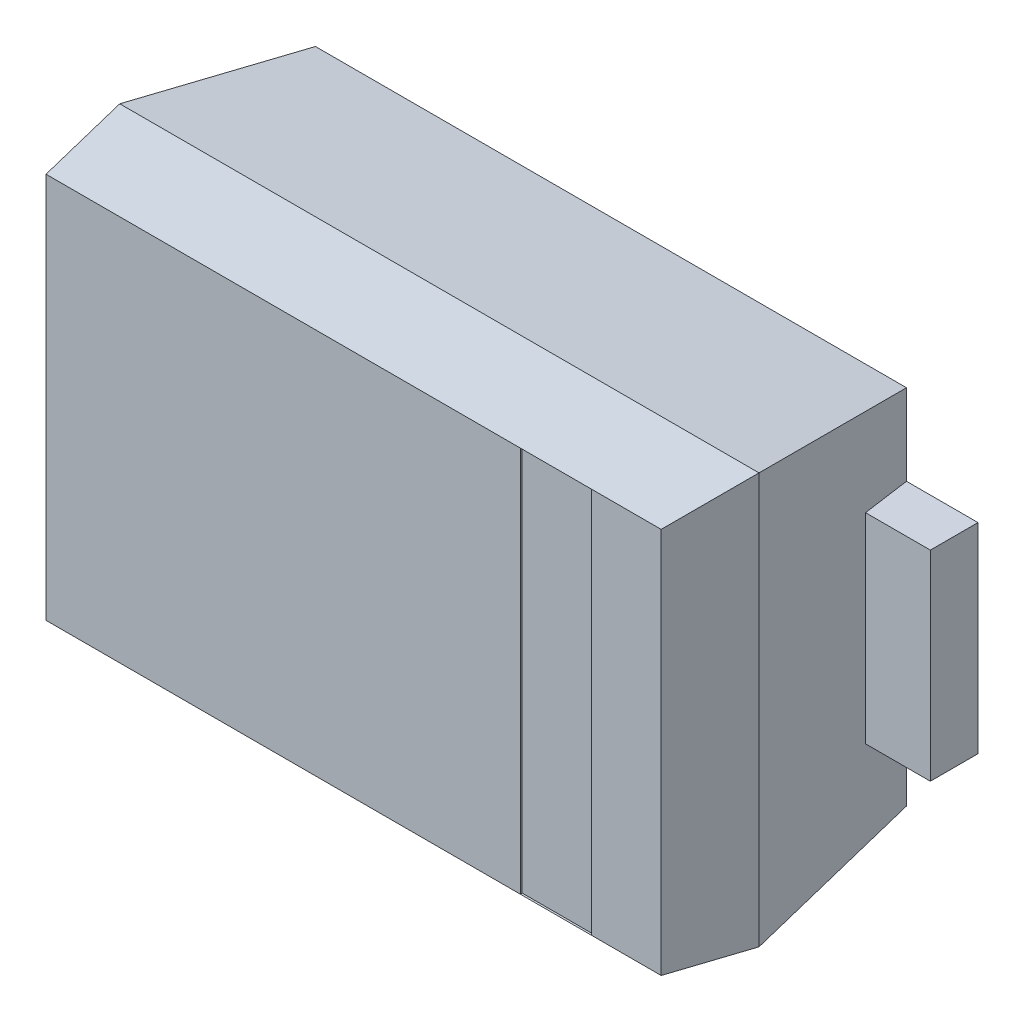
ISO-10303-21;
HEADER;
FILE_DESCRIPTION(('STEP AP214'),'2;1');
FILE_NAME('part.step','',(''),(''),'','','');
FILE_SCHEMA(('AUTOMOTIVE_DESIGN { 1 0 10303 214 1 1 1 1 }'));
ENDSEC;
DATA;
#1=APPLICATION_CONTEXT('core data for automotive mechanical design processes');
#2=APPLICATION_PROTOCOL_DEFINITION('international standard','automotive_design',2000,#1);
#3=PRODUCT_CONTEXT('',#1,'mechanical');
#4=PRODUCT('Part','Part','',(#3));
#5=PRODUCT_RELATED_PRODUCT_CATEGORY('part','',(#4));
#6=PRODUCT_DEFINITION_FORMATION('','',#4);
#7=PRODUCT_DEFINITION_CONTEXT('part definition',#1,'design');
#8=PRODUCT_DEFINITION('design','',#6,#7);
#9=PRODUCT_DEFINITION_SHAPE('','',#8);
#10=(LENGTH_UNIT() NAMED_UNIT(*) SI_UNIT(.MILLI.,.METRE.));
#11=(NAMED_UNIT(*) PLANE_ANGLE_UNIT() SI_UNIT($,.RADIAN.));
#12=(NAMED_UNIT(*) SI_UNIT($,.STERADIAN.) SOLID_ANGLE_UNIT());
#13=UNCERTAINTY_MEASURE_WITH_UNIT(LENGTH_MEASURE(1.E-05),#10,'distance_accuracy_value','');
#14=(GEOMETRIC_REPRESENTATION_CONTEXT(3) GLOBAL_UNCERTAINTY_ASSIGNED_CONTEXT((#13)) GLOBAL_UNIT_ASSIGNED_CONTEXT((#10,
#11,#12)) REPRESENTATION_CONTEXT('',''));
#15=CARTESIAN_POINT('',(0.,0.,0.));
#16=DIRECTION('',(0.,0.,1.));
#17=DIRECTION('',(1.,0.,0.));
#18=AXIS2_PLACEMENT_3D('',#15,#16,#17);
#19=CARTESIAN_POINT('',(0.,0.,1.35));
#20=DIRECTION('',(0.,0.,-1.));
#21=DIRECTION('',(-1.,0.,0.));
#22=AXIS2_PLACEMENT_3D('',#19,#20,#21);
#23=PLANE('',#22);
#24=DIRECTION('',(1.,0.,0.));
#25=VECTOR('',#24,1.);
#26=CARTESIAN_POINT('',(0.,1.01324337561608,1.35));
#27=LINE('',#26,#25);
#28=CARTESIAN_POINT('',(1.61324337561608,1.01324337561608,1.35));
#29=VERTEX_POINT('',#28);
#30=CARTESIAN_POINT('',(1.24663932732601,1.01324337561608,1.35));
#31=VERTEX_POINT('',#30);
#32=EDGE_CURVE('E227',#29,#31,#27,.F.);
#33=ORIENTED_EDGE('',*,*,#32,.T.);
#34=DIRECTION('',(0.,1.,0.));
#35=VECTOR('',#34,1.);
#36=CARTESIAN_POINT('',(1.24663932732601,1.01324337561608,1.35));
#37=LINE('',#36,#35);
#38=CARTESIAN_POINT('',(1.24663932732601,-1.01324337561608,1.35));
#39=VERTEX_POINT('',#38);
#40=EDGE_CURVE('E53',#39,#31,#37,.T.);
#41=ORIENTED_EDGE('',*,*,#40,.F.);
#42=DIRECTION('',(-1.,0.,0.));
#43=VECTOR('',#42,1.);
#44=CARTESIAN_POINT('',(0.,-1.01324337561608,1.35));
#45=LINE('',#44,#43);
#46=CARTESIAN_POINT('',(1.61324337561608,-1.01324337561608,1.35));
#47=VERTEX_POINT('',#46);
#48=EDGE_CURVE('E237',#39,#47,#45,.F.);
#49=ORIENTED_EDGE('',*,*,#48,.T.);
#50=DIRECTION('',(0.,-1.,0.));
#51=VECTOR('',#50,1.);
#52=CARTESIAN_POINT('',(1.61324337561608,0.,1.35));
#53=LINE('',#52,#51);
#54=EDGE_CURVE('E242',#47,#29,#53,.F.);
#55=ORIENTED_EDGE('',*,*,#54,.T.);
#56=EDGE_LOOP('',(#33,#41,#49,#55));
#57=FACE_BOUND('',#56,.T.);
#58=ADVANCED_FACE('F37',(#57),#23,.F.);
#59=CARTESIAN_POINT('',(1.925,-0.524999999999999,0.25));
#60=DIRECTION('',(0.,1.,0.));
#61=DIRECTION('',(-1.,0.,0.));
#62=AXIS2_PLACEMENT_3D('',#59,#60,#61);
#63=PLANE('',#62);
#64=DIRECTION('',(1.,0.,0.));
#65=VECTOR('',#64,1.);
#66=CARTESIAN_POINT('',(1.925,-0.524999999999999,0.25));
#67=LINE('',#66,#65);
#68=CARTESIAN_POINT('',(1.5851352086756,-0.524999999999999,0.25));
#69=VERTEX_POINT('',#68);
#70=CARTESIAN_POINT('',(1.925,-0.524999999999999,0.25));
#71=VERTEX_POINT('',#70);
#72=EDGE_CURVE('E321',#69,#71,#67,.T.);
#73=ORIENTED_EDGE('',*,*,#72,.F.);
#74=DIRECTION('',(-0.139173100960066,0.,-0.99026806874157));
#75=VECTOR('',#74,1.);
#76=CARTESIAN_POINT('',(1.59171810148869,-0.524999999999999,0.296839716207978));
#77=LINE('',#76,#75);
#78=CARTESIAN_POINT('',(1.55,-0.524999999999999,0.));
#79=VERTEX_POINT('',#78);
#80=EDGE_CURVE('E312',#69,#79,#77,.T.);
#81=ORIENTED_EDGE('',*,*,#80,.T.);
#82=DIRECTION('',(1.,0.,0.));
#83=VECTOR('',#82,1.);
#84=CARTESIAN_POINT('',(1.925,-0.524999999999999,0.));
#85=LINE('',#84,#83);
#86=CARTESIAN_POINT('',(1.925,-0.524999999999999,0.));
#87=VERTEX_POINT('',#86);
#88=EDGE_CURVE('E339',#79,#87,#85,.T.);
#89=ORIENTED_EDGE('',*,*,#88,.T.);
#90=DIRECTION('',(0.,0.,-1.));
#91=VECTOR('',#90,1.);
#92=CARTESIAN_POINT('',(1.925,-0.524999999999999,0.25));
#93=LINE('',#92,#91);
#94=EDGE_CURVE('E46',#71,#87,#93,.T.);
#95=ORIENTED_EDGE('',*,*,#94,.F.);
#96=EDGE_LOOP('',(#73,#81,#89,#95));
#97=FACE_BOUND('',#96,.T.);
#98=ADVANCED_FACE('F392',(#97),#63,.F.);
#99=CARTESIAN_POINT('',(1.925,0.525000000000002,0.25));
#100=DIRECTION('',(0.,-1.,0.));
#101=DIRECTION('',(0.,0.,-1.));
#102=AXIS2_PLACEMENT_3D('',#99,#100,#101);
#103=PLANE('',#102);
#104=DIRECTION('',(-1.,0.,0.));
#105=VECTOR('',#104,1.);
#106=CARTESIAN_POINT('',(1.925,0.525000000000002,0.));
#107=LINE('',#106,#105);
#108=CARTESIAN_POINT('',(1.925,0.525000000000002,0.));
#109=VERTEX_POINT('',#108);
#110=CARTESIAN_POINT('',(1.55,0.525000000000002,0.));
#111=VERTEX_POINT('',#110);
#112=EDGE_CURVE('E322',#109,#111,#107,.T.);
#113=ORIENTED_EDGE('',*,*,#112,.T.);
#114=DIRECTION('',(0.139173100960066,0.,0.99026806874157));
#115=VECTOR('',#114,1.);
#116=CARTESIAN_POINT('',(1.59171810148869,0.525000000000002,0.296839716207978));
#117=LINE('',#116,#115);
#118=CARTESIAN_POINT('',(1.5851352086756,0.525000000000002,0.25));
#119=VERTEX_POINT('',#118);
#120=EDGE_CURVE('E308',#111,#119,#117,.T.);
#121=ORIENTED_EDGE('',*,*,#120,.T.);
#122=DIRECTION('',(-1.,0.,0.));
#123=VECTOR('',#122,1.);
#124=CARTESIAN_POINT('',(1.925,0.525000000000002,0.25));
#125=LINE('',#124,#123);
#126=CARTESIAN_POINT('',(1.925,0.525000000000002,0.25));
#127=VERTEX_POINT('',#126);
#128=EDGE_CURVE('E331',#127,#119,#125,.T.);
#129=ORIENTED_EDGE('',*,*,#128,.F.);
#130=DIRECTION('',(0.,0.,-1.));
#131=VECTOR('',#130,1.);
#132=CARTESIAN_POINT('',(1.925,0.525000000000002,0.25));
#133=LINE('',#132,#131);
#134=EDGE_CURVE('E354',#127,#109,#133,.T.);
#135=ORIENTED_EDGE('',*,*,#134,.T.);
#136=EDGE_LOOP('',(#113,#121,#129,#135));
#137=FACE_BOUND('',#136,.T.);
#138=ADVANCED_FACE('F375',(#137),#103,.F.);
#139=CARTESIAN_POINT('',(0.,0.,0.25));
#140=DIRECTION('',(0.,0.,-1.));
#141=DIRECTION('',(-1.,0.,0.));
#142=AXIS2_PLACEMENT_3D('',#139,#140,#141);
#143=PLANE('',#142);
#144=ORIENTED_EDGE('',*,*,#128,.T.);
#145=DIRECTION('',(0.,-1.,0.));
#146=VECTOR('',#145,1.);
#147=CARTESIAN_POINT('',(1.5851352086756,0.,0.25));
#148=LINE('',#147,#146);
#149=EDGE_CURVE('E304',#119,#69,#148,.T.);
#150=ORIENTED_EDGE('',*,*,#149,.T.);
#151=ORIENTED_EDGE('',*,*,#72,.T.);
#152=DIRECTION('',(0.,1.,0.));
#153=VECTOR('',#152,1.);
#154=CARTESIAN_POINT('',(1.925,0.525000000000002,0.25));
#155=LINE('',#154,#153);
#156=EDGE_CURVE('E327',#71,#127,#155,.T.);
#157=ORIENTED_EDGE('',*,*,#156,.T.);
#158=EDGE_LOOP('',(#144,#150,#151,#157));
#159=FACE_BOUND('',#158,.T.);
#160=ADVANCED_FACE('F378',(#159),#143,.F.);
#161=CARTESIAN_POINT('',(-1.925,0.525000000000002,0.25));
#162=DIRECTION('',(1.,0.,0.));
#163=DIRECTION('',(0.,0.,-1.));
#164=AXIS2_PLACEMENT_3D('',#161,#162,#163);
#165=PLANE('',#164);
#166=DIRECTION('',(0.,-1.,0.));
#167=VECTOR('',#166,1.);
#168=CARTESIAN_POINT('',(-1.925,0.525000000000002,0.));
#169=LINE('',#168,#167);
#170=CARTESIAN_POINT('',(-1.925,0.525000000000002,0.));
#171=VERTEX_POINT('',#170);
#172=CARTESIAN_POINT('',(-1.925,-0.524999999999999,0.));
#173=VERTEX_POINT('',#172);
#174=EDGE_CURVE('E316',#171,#173,#169,.T.);
#175=ORIENTED_EDGE('',*,*,#174,.T.);
#176=DIRECTION('',(0.,0.,-1.));
#177=VECTOR('',#176,1.);
#178=CARTESIAN_POINT('',(-1.925,-0.524999999999999,0.25));
#179=LINE('',#178,#177);
#180=CARTESIAN_POINT('',(-1.925,-0.524999999999999,0.25));
#181=VERTEX_POINT('',#180);
#182=EDGE_CURVE('E11',#181,#173,#179,.T.);
#183=ORIENTED_EDGE('',*,*,#182,.F.);
#184=DIRECTION('',(0.,-1.,0.));
#185=VECTOR('',#184,1.);
#186=CARTESIAN_POINT('',(-1.925,0.525000000000002,0.25));
#187=LINE('',#186,#185);
#188=CARTESIAN_POINT('',(-1.925,0.525000000000002,0.25));
#189=VERTEX_POINT('',#188);
#190=EDGE_CURVE('E317',#189,#181,#187,.T.);
#191=ORIENTED_EDGE('',*,*,#190,.F.);
#192=DIRECTION('',(0.,0.,-1.));
#193=VECTOR('',#192,1.);
#194=CARTESIAN_POINT('',(-1.925,0.525000000000002,0.25));
#195=LINE('',#194,#193);
#196=EDGE_CURVE('E335',#189,#171,#195,.T.);
#197=ORIENTED_EDGE('',*,*,#196,.T.);
#198=EDGE_LOOP('',(#175,#183,#191,#197));
#199=FACE_BOUND('',#198,.T.);
#200=ADVANCED_FACE('F39',(#199),#165,.F.);
#201=CARTESIAN_POINT('',(-1.55,-0.525,0.));
#202=VERTEX_POINT('',#201);
#203=EDGE_CURVE('E340',#173,#202,#85,.T.);
#204=ORIENTED_EDGE('',*,*,#203,.T.);
#205=DIRECTION('',(-0.139173100960066,0.,0.99026806874157));
#206=VECTOR('',#205,1.);
#207=CARTESIAN_POINT('',(-1.51714686616995,-0.524999999999999,-0.233762193739748));
#208=LINE('',#207,#206);
#209=CARTESIAN_POINT('',(-1.5851352086756,-0.524999999999999,0.25));
#210=VERTEX_POINT('',#209);
#211=EDGE_CURVE('E300',#202,#210,#208,.T.);
#212=ORIENTED_EDGE('',*,*,#211,.T.);
#213=EDGE_CURVE('E323',#181,#210,#67,.T.);
#214=ORIENTED_EDGE('',*,*,#213,.F.);
#215=ORIENTED_EDGE('',*,*,#182,.T.);
#216=EDGE_LOOP('',(#204,#212,#214,#215));
#217=FACE_BOUND('',#216,.T.);
#218=ADVANCED_FACE('F404',(#217),#63,.F.);
#219=CARTESIAN_POINT('',(1.925,0.525000000000002,0.25));
#220=DIRECTION('',(-1.,0.,0.));
#221=DIRECTION('',(0.,-1.,0.));
#222=AXIS2_PLACEMENT_3D('',#219,#220,#221);
#223=PLANE('',#222);
#224=DIRECTION('',(0.,1.,0.));
#225=VECTOR('',#224,1.);
#226=CARTESIAN_POINT('',(1.925,0.525000000000002,0.));
#227=LINE('',#226,#225);
#228=EDGE_CURVE('E344',#87,#109,#227,.T.);
#229=ORIENTED_EDGE('',*,*,#228,.T.);
#230=ORIENTED_EDGE('',*,*,#134,.F.);
#231=ORIENTED_EDGE('',*,*,#156,.F.);
#232=ORIENTED_EDGE('',*,*,#94,.T.);
#233=EDGE_LOOP('',(#229,#230,#231,#232));
#234=FACE_BOUND('',#233,.T.);
#235=ADVANCED_FACE('F364',(#234),#223,.F.);
#236=CARTESIAN_POINT('',(-1.5851352086756,0.525000000000002,0.25));
#237=VERTEX_POINT('',#236);
#238=EDGE_CURVE('E330',#237,#189,#125,.T.);
#239=ORIENTED_EDGE('',*,*,#238,.F.);
#240=DIRECTION('',(0.139173100960066,0.,-0.99026806874157));
#241=VECTOR('',#240,1.);
#242=CARTESIAN_POINT('',(-1.51714686616995,0.525000000000002,-0.233762193739748));
#243=LINE('',#242,#241);
#244=CARTESIAN_POINT('',(-1.55,0.525000000000002,0.));
#245=VERTEX_POINT('',#244);
#246=EDGE_CURVE('E61',#237,#245,#243,.T.);
#247=ORIENTED_EDGE('',*,*,#246,.T.);
#248=EDGE_CURVE('E347',#245,#171,#107,.T.);
#249=ORIENTED_EDGE('',*,*,#248,.T.);
#250=ORIENTED_EDGE('',*,*,#196,.F.);
#251=EDGE_LOOP('',(#239,#247,#249,#250));
#252=FACE_BOUND('',#251,.T.);
#253=ADVANCED_FACE('F398',(#252),#103,.F.);
#254=ORIENTED_EDGE('',*,*,#213,.T.);
#255=DIRECTION('',(0.,1.,0.));
#256=VECTOR('',#255,1.);
#257=CARTESIAN_POINT('',(-1.5851352086756,0.,0.25));
#258=LINE('',#257,#256);
#259=EDGE_CURVE('E270',#210,#237,#258,.T.);
#260=ORIENTED_EDGE('',*,*,#259,.T.);
#261=ORIENTED_EDGE('',*,*,#238,.T.);
#262=ORIENTED_EDGE('',*,*,#190,.T.);
#263=EDGE_LOOP('',(#254,#260,#261,#262));
#264=FACE_BOUND('',#263,.T.);
#265=ADVANCED_FACE('F406',(#264),#143,.F.);
#266=CARTESIAN_POINT('',(0.,0.,0.));
#267=DIRECTION('',(0.,0.,-1.));
#268=DIRECTION('',(-1.,0.,0.));
#269=AXIS2_PLACEMENT_3D('',#266,#267,#268);
#270=PLANE('',#269);
#271=ORIENTED_EDGE('',*,*,#248,.F.);
#272=DIRECTION('',(0.,1.,0.));
#273=VECTOR('',#272,1.);
#274=CARTESIAN_POINT('',(-1.55,0.95,0.));
#275=LINE('',#274,#273);
#276=CARTESIAN_POINT('',(-1.55,0.95,0.));
#277=VERTEX_POINT('',#276);
#278=EDGE_CURVE('E257',#245,#277,#275,.T.);
#279=ORIENTED_EDGE('',*,*,#278,.T.);
#280=DIRECTION('',(1.,0.,0.));
#281=VECTOR('',#280,1.);
#282=CARTESIAN_POINT('',(-1.55,0.95,0.));
#283=LINE('',#282,#281);
#284=CARTESIAN_POINT('',(1.55,0.95,0.));
#285=VERTEX_POINT('',#284);
#286=EDGE_CURVE('E262',#277,#285,#283,.T.);
#287=ORIENTED_EDGE('',*,*,#286,.T.);
#288=DIRECTION('',(0.,-1.,0.));
#289=VECTOR('',#288,1.);
#290=CARTESIAN_POINT('',(1.55,0.95,0.));
#291=LINE('',#290,#289);
#292=EDGE_CURVE('E249',#285,#111,#291,.T.);
#293=ORIENTED_EDGE('',*,*,#292,.T.);
#294=ORIENTED_EDGE('',*,*,#112,.F.);
#295=ORIENTED_EDGE('',*,*,#228,.F.);
#296=ORIENTED_EDGE('',*,*,#88,.F.);
#297=CARTESIAN_POINT('',(1.55,-0.95,0.));
#298=VERTEX_POINT('',#297);
#299=EDGE_CURVE('E220',#79,#298,#291,.T.);
#300=ORIENTED_EDGE('',*,*,#299,.T.);
#301=DIRECTION('',(-1.,0.,0.));
#302=VECTOR('',#301,1.);
#303=CARTESIAN_POINT('',(-1.55,-0.95,0.));
#304=LINE('',#303,#302);
#305=CARTESIAN_POINT('',(-1.55,-0.95,0.));
#306=VERTEX_POINT('',#305);
#307=EDGE_CURVE('E253',#298,#306,#304,.T.);
#308=ORIENTED_EDGE('',*,*,#307,.T.);
#309=EDGE_CURVE('E258',#306,#202,#275,.T.);
#310=ORIENTED_EDGE('',*,*,#309,.T.);
#311=ORIENTED_EDGE('',*,*,#203,.F.);
#312=ORIENTED_EDGE('',*,*,#174,.F.);
#313=EDGE_LOOP('',(#271,#279,#287,#293,#294,#295,#296,#300,#308,#310,#311,#312));
#314=FACE_BOUND('',#313,.T.);
#315=ADVANCED_FACE('F372',(#314),#270,.T.);
#316=CARTESIAN_POINT('',(1.55,0.95,0.));
#317=DIRECTION('',(0.99026806874157,0.,-0.139173100960066));
#318=DIRECTION('',(-0.139173100960066,0.,-0.99026806874157));
#319=AXIS2_PLACEMENT_3D('',#316,#317,#318);
#320=PLANE('',#319);
#321=ORIENTED_EDGE('',*,*,#80,.F.);
#322=ORIENTED_EDGE('',*,*,#149,.F.);
#323=ORIENTED_EDGE('',*,*,#120,.F.);
#324=ORIENTED_EDGE('',*,*,#292,.F.);
#325=DIRECTION('',(-0.137844537491629,-0.137844537491629,-0.980814848463989));
#326=VECTOR('',#325,1.);
#327=CARTESIAN_POINT('',(1.49109653879953,0.891096538799528,-0.419119904369466));
#328=LINE('',#327,#326);
#329=CARTESIAN_POINT('',(1.67648675123215,1.07648675123215,0.9));
#330=VERTEX_POINT('',#329);
#331=EDGE_CURVE('E267',#330,#285,#328,.T.);
#332=ORIENTED_EDGE('',*,*,#331,.F.);
#333=DIRECTION('',(0.,-1.,0.));
#334=VECTOR('',#333,1.);
#335=CARTESIAN_POINT('',(1.67648675123215,0.95,0.9));
#336=LINE('',#335,#334);
#337=CARTESIAN_POINT('',(1.67648675123215,-1.07648675123215,0.9));
#338=VERTEX_POINT('',#337);
#339=EDGE_CURVE('E266',#330,#338,#336,.T.);
#340=ORIENTED_EDGE('',*,*,#339,.T.);
#341=DIRECTION('',(-0.137844537491629,0.137844537491629,-0.980814848463989));
#342=VECTOR('',#341,1.);
#343=CARTESIAN_POINT('',(1.51389787861907,-0.913897878619066,-0.256879941387737));
#344=LINE('',#343,#342);
#345=EDGE_CURVE('E272',#338,#298,#344,.T.);
#346=ORIENTED_EDGE('',*,*,#345,.T.);
#347=ORIENTED_EDGE('',*,*,#299,.F.);
#348=EDGE_LOOP('',(#321,#322,#323,#324,#332,#340,#346,#347));
#349=FACE_BOUND('',#348,.T.);
#350=ADVANCED_FACE('F391',(#349),#320,.T.);
#351=CARTESIAN_POINT('',(-1.55,0.95,0.));
#352=DIRECTION('',(-0.99026806874157,0.,-0.139173100960066));
#353=DIRECTION('',(-0.139173100960066,0.,0.99026806874157));
#354=AXIS2_PLACEMENT_3D('',#351,#352,#353);
#355=PLANE('',#354);
#356=ORIENTED_EDGE('',*,*,#211,.F.);
#357=ORIENTED_EDGE('',*,*,#309,.F.);
#358=DIRECTION('',(0.137844537491629,0.137844537491629,-0.980814848463989));
#359=VECTOR('',#358,1.);
#360=CARTESIAN_POINT('',(-1.55,-0.95,0.));
#361=LINE('',#360,#359);
#362=CARTESIAN_POINT('',(-1.67648675123215,-1.07648675123215,0.9));
#363=VERTEX_POINT('',#362);
#364=EDGE_CURVE('E276',#363,#306,#361,.T.);
#365=ORIENTED_EDGE('',*,*,#364,.F.);
#366=DIRECTION('',(0.,1.,0.));
#367=VECTOR('',#366,1.);
#368=CARTESIAN_POINT('',(-1.67648675123215,0.95,0.9));
#369=LINE('',#368,#367);
#370=CARTESIAN_POINT('',(-1.67648675123215,1.07648675123215,0.9));
#371=VERTEX_POINT('',#370);
#372=EDGE_CURVE('E290',#363,#371,#369,.T.);
#373=ORIENTED_EDGE('',*,*,#372,.T.);
#374=DIRECTION('',(0.137844537491629,-0.137844537491629,-0.980814848463989));
#375=VECTOR('',#374,1.);
#376=CARTESIAN_POINT('',(-1.55,0.95,0.));
#377=LINE('',#376,#375);
#378=EDGE_CURVE('E271',#371,#277,#377,.T.);
#379=ORIENTED_EDGE('',*,*,#378,.T.);
#380=ORIENTED_EDGE('',*,*,#278,.F.);
#381=ORIENTED_EDGE('',*,*,#246,.F.);
#382=ORIENTED_EDGE('',*,*,#259,.F.);
#383=EDGE_LOOP('',(#356,#357,#365,#373,#379,#380,#381,#382));
#384=FACE_BOUND('',#383,.T.);
#385=ADVANCED_FACE('F385',(#384),#355,.T.);
#386=CARTESIAN_POINT('',(-1.55,0.95,0.));
#387=DIRECTION('',(0.,0.99026806874157,-0.139173100960066));
#388=DIRECTION('',(0.,0.139173100960066,0.99026806874157));
#389=AXIS2_PLACEMENT_3D('',#386,#387,#388);
#390=PLANE('',#389);
#391=ORIENTED_EDGE('',*,*,#286,.F.);
#392=ORIENTED_EDGE('',*,*,#378,.F.);
#393=DIRECTION('',(1.,0.,0.));
#394=VECTOR('',#393,1.);
#395=CARTESIAN_POINT('',(-1.55,1.07648675123215,0.9));
#396=LINE('',#395,#394);
#397=EDGE_CURVE('E277',#371,#330,#396,.T.);
#398=ORIENTED_EDGE('',*,*,#397,.T.);
#399=ORIENTED_EDGE('',*,*,#331,.T.);
#400=EDGE_LOOP('',(#391,#392,#398,#399));
#401=FACE_BOUND('',#400,.T.);
#402=ADVANCED_FACE('F388',(#401),#390,.T.);
#403=CARTESIAN_POINT('',(-1.55,-0.95,0.));
#404=DIRECTION('',(0.,-0.99026806874157,-0.139173100960066));
#405=DIRECTION('',(0.,0.139173100960066,-0.99026806874157));
#406=AXIS2_PLACEMENT_3D('',#403,#404,#405);
#407=PLANE('',#406);
#408=ORIENTED_EDGE('',*,*,#307,.F.);
#409=ORIENTED_EDGE('',*,*,#345,.F.);
#410=DIRECTION('',(-1.,0.,0.));
#411=VECTOR('',#410,1.);
#412=CARTESIAN_POINT('',(-1.55,-1.07648675123215,0.9));
#413=LINE('',#412,#411);
#414=EDGE_CURVE('E286',#338,#363,#413,.T.);
#415=ORIENTED_EDGE('',*,*,#414,.T.);
#416=ORIENTED_EDGE('',*,*,#364,.T.);
#417=EDGE_LOOP('',(#408,#409,#415,#416));
#418=FACE_BOUND('',#417,.T.);
#419=ADVANCED_FACE('F410',(#418),#407,.T.);
#420=CARTESIAN_POINT('',(-1.67648675123215,1.07648675123215,0.9));
#421=DIRECTION('',(-0.99026806874157,0.,0.139173100960066));
#422=DIRECTION('',(0.139173100960066,0.,0.99026806874157));
#423=AXIS2_PLACEMENT_3D('',#420,#421,#422);
#424=PLANE('',#423);
#425=ORIENTED_EDGE('',*,*,#372,.F.);
#426=DIRECTION('',(-0.137844537491629,-0.137844537491629,-0.980814848463989));
#427=VECTOR('',#426,1.);
#428=CARTESIAN_POINT('',(-1.61277651103582,-1.01277651103583,1.35332191409877));
#429=LINE('',#428,#427);
#430=CARTESIAN_POINT('',(-1.61324337561608,-1.01324337561608,1.35));
#431=VERTEX_POINT('',#430);
#432=EDGE_CURVE('E216',#431,#363,#429,.T.);
#433=ORIENTED_EDGE('',*,*,#432,.F.);
#434=DIRECTION('',(0.,1.,0.));
#435=VECTOR('',#434,1.);
#436=CARTESIAN_POINT('',(-1.61324337561608,0.,1.35));
#437=LINE('',#436,#435);
#438=CARTESIAN_POINT('',(-1.61324337561608,1.01324337561608,1.35));
#439=VERTEX_POINT('',#438);
#440=EDGE_CURVE('E210',#439,#431,#437,.F.);
#441=ORIENTED_EDGE('',*,*,#440,.F.);
#442=DIRECTION('',(-0.137844537491629,0.137844537491629,-0.980814848463989));
#443=VECTOR('',#442,1.);
#444=CARTESIAN_POINT('',(-1.67648675123215,1.07648675123215,0.9));
#445=LINE('',#444,#443);
#446=EDGE_CURVE('E222',#439,#371,#445,.T.);
#447=ORIENTED_EDGE('',*,*,#446,.T.);
#448=EDGE_LOOP('',(#425,#433,#441,#447));
#449=FACE_BOUND('',#448,.T.);
#450=ADVANCED_FACE('F431',(#449),#424,.T.);
#451=CARTESIAN_POINT('',(1.67648675123215,-1.07648675123215,0.9));
#452=DIRECTION('',(0.,-0.99026806874157,0.139173100960066));
#453=DIRECTION('',(0.,-0.139173100960066,-0.99026806874157));
#454=AXIS2_PLACEMENT_3D('',#451,#452,#453);
#455=PLANE('',#454);
#456=ORIENTED_EDGE('',*,*,#414,.F.);
#457=DIRECTION('',(0.137844537491629,-0.137844537491629,-0.980814848463989));
#458=VECTOR('',#457,1.);
#459=CARTESIAN_POINT('',(1.63557785085536,-1.03557785085536,1.19108195111704));
#460=LINE('',#459,#458);
#461=EDGE_CURVE('E221',#47,#338,#460,.T.);
#462=ORIENTED_EDGE('',*,*,#461,.F.);
#463=ORIENTED_EDGE('',*,*,#48,.F.);
#464=DIRECTION('',(1.,0.,0.));
#465=VECTOR('',#464,1.);
#466=CARTESIAN_POINT('',(1.24663932732601,-1.01324337561608,1.35));
#467=LINE('',#466,#465);
#468=CARTESIAN_POINT('',(0.874339799708289,-1.01324337561608,1.35));
#469=VERTEX_POINT('',#468);
#470=EDGE_CURVE('E186',#469,#39,#467,.T.);
#471=ORIENTED_EDGE('',*,*,#470,.F.);
#472=EDGE_CURVE('E238',#431,#469,#45,.F.);
#473=ORIENTED_EDGE('',*,*,#472,.F.);
#474=ORIENTED_EDGE('',*,*,#432,.T.);
#475=EDGE_LOOP('',(#456,#462,#463,#471,#473,#474));
#476=FACE_BOUND('',#475,.T.);
#477=ADVANCED_FACE('F413',(#476),#455,.T.);
#478=CARTESIAN_POINT('',(1.67648675123215,1.07648675123215,0.9));
#479=DIRECTION('',(0.99026806874157,0.,0.139173100960066));
#480=DIRECTION('',(0.139173100960066,0.,-0.99026806874157));
#481=AXIS2_PLACEMENT_3D('',#478,#479,#480);
#482=PLANE('',#481);
#483=ORIENTED_EDGE('',*,*,#339,.F.);
#484=DIRECTION('',(0.137844537491629,0.137844537491629,-0.980814848463989));
#485=VECTOR('',#484,1.);
#486=CARTESIAN_POINT('',(1.67648675123215,1.07648675123215,0.9));
#487=LINE('',#486,#485);
#488=EDGE_CURVE('E226',#29,#330,#487,.T.);
#489=ORIENTED_EDGE('',*,*,#488,.F.);
#490=ORIENTED_EDGE('',*,*,#54,.F.);
#491=ORIENTED_EDGE('',*,*,#461,.T.);
#492=EDGE_LOOP('',(#483,#489,#490,#491));
#493=FACE_BOUND('',#492,.T.);
#494=ADVANCED_FACE('F418',(#493),#482,.T.);
#495=CARTESIAN_POINT('',(1.67648675123215,1.07648675123215,0.9));
#496=DIRECTION('',(0.,0.99026806874157,0.139173100960066));
#497=DIRECTION('',(0.,-0.139173100960066,0.99026806874157));
#498=AXIS2_PLACEMENT_3D('',#495,#496,#497);
#499=PLANE('',#498);
#500=ORIENTED_EDGE('',*,*,#397,.F.);
#501=ORIENTED_EDGE('',*,*,#446,.F.);
#502=CARTESIAN_POINT('',(0.874339799708289,1.01324337561608,1.35));
#503=VERTEX_POINT('',#502);
#504=EDGE_CURVE('E245',#503,#439,#27,.F.);
#505=ORIENTED_EDGE('',*,*,#504,.F.);
#506=DIRECTION('',(-1.,0.,0.));
#507=VECTOR('',#506,1.);
#508=CARTESIAN_POINT('',(1.24663932732601,1.01324337561608,1.35));
#509=LINE('',#508,#507);
#510=EDGE_CURVE('E201',#31,#503,#509,.T.);
#511=ORIENTED_EDGE('',*,*,#510,.F.);
#512=ORIENTED_EDGE('',*,*,#32,.F.);
#513=ORIENTED_EDGE('',*,*,#488,.T.);
#514=EDGE_LOOP('',(#500,#501,#505,#511,#512,#513));
#515=FACE_BOUND('',#514,.T.);
#516=ADVANCED_FACE('F433',(#515),#499,.T.);
#517=ORIENTED_EDGE('',*,*,#472,.T.);
#518=DIRECTION('',(0.,-1.,0.));
#519=VECTOR('',#518,1.);
#520=CARTESIAN_POINT('',(0.874339799708289,1.01324337561608,1.35));
#521=LINE('',#520,#519);
#522=EDGE_CURVE('E192',#503,#469,#521,.T.);
#523=ORIENTED_EDGE('',*,*,#522,.F.);
#524=ORIENTED_EDGE('',*,*,#504,.T.);
#525=ORIENTED_EDGE('',*,*,#440,.T.);
#526=EDGE_LOOP('',(#517,#523,#524,#525));
#527=FACE_BOUND('',#526,.T.);
#528=ADVANCED_FACE('F426',(#527),#23,.F.);
#529=CARTESIAN_POINT('',(1.24663932732601,1.01324337561608,1.34));
#530=DIRECTION('',(1.,0.,0.));
#531=DIRECTION('',(0.,0.,-1.));
#532=AXIS2_PLACEMENT_3D('',#529,#530,#531);
#533=PLANE('',#532);
#534=ORIENTED_EDGE('',*,*,#40,.T.);
#535=DIRECTION('',(0.,0.,1.));
#536=VECTOR('',#535,1.);
#537=CARTESIAN_POINT('',(1.24663932732601,1.01324337561608,1.34));
#538=LINE('',#537,#536);
#539=CARTESIAN_POINT('',(1.24663932732601,1.01324337561608,1.34));
#540=VERTEX_POINT('',#539);
#541=EDGE_CURVE('E161',#540,#31,#538,.T.);
#542=ORIENTED_EDGE('',*,*,#541,.F.);
#543=DIRECTION('',(0.,1.,0.));
#544=VECTOR('',#543,1.);
#545=CARTESIAN_POINT('',(1.24663932732601,1.01324337561608,1.34));
#546=LINE('',#545,#544);
#547=CARTESIAN_POINT('',(1.24663932732601,-1.01324337561608,1.34));
#548=VERTEX_POINT('',#547);
#549=EDGE_CURVE('E165',#548,#540,#546,.T.);
#550=ORIENTED_EDGE('',*,*,#549,.F.);
#551=DIRECTION('',(0.,0.,1.));
#552=VECTOR('',#551,1.);
#553=CARTESIAN_POINT('',(1.24663932732601,-1.01324337561608,1.34));
#554=LINE('',#553,#552);
#555=EDGE_CURVE('E207',#548,#39,#554,.T.);
#556=ORIENTED_EDGE('',*,*,#555,.T.);
#557=EDGE_LOOP('',(#534,#542,#550,#556));
#558=FACE_BOUND('',#557,.T.);
#559=ADVANCED_FACE('F163',(#558),#533,.F.);
#560=CARTESIAN_POINT('',(1.24663932732601,-1.01324337561608,1.34));
#561=DIRECTION('',(0.,-1.,0.));
#562=DIRECTION('',(0.,0.,-1.));
#563=AXIS2_PLACEMENT_3D('',#560,#561,#562);
#564=PLANE('',#563);
#565=ORIENTED_EDGE('',*,*,#470,.T.);
#566=ORIENTED_EDGE('',*,*,#555,.F.);
#567=DIRECTION('',(1.,0.,0.));
#568=VECTOR('',#567,1.);
#569=CARTESIAN_POINT('',(1.24663932732601,-1.01324337561608,1.34));
#570=LINE('',#569,#568);
#571=CARTESIAN_POINT('',(0.874339799708289,-1.01324337561608,1.34));
#572=VERTEX_POINT('',#571);
#573=EDGE_CURVE('E172',#572,#548,#570,.T.);
#574=ORIENTED_EDGE('',*,*,#573,.F.);
#575=DIRECTION('',(0.,0.,1.));
#576=VECTOR('',#575,1.);
#577=CARTESIAN_POINT('',(0.874339799708289,-1.01324337561608,1.34));
#578=LINE('',#577,#576);
#579=EDGE_CURVE('E211',#572,#469,#578,.T.);
#580=ORIENTED_EDGE('',*,*,#579,.T.);
#581=EDGE_LOOP('',(#565,#566,#574,#580));
#582=FACE_BOUND('',#581,.T.);
#583=ADVANCED_FACE('F525',(#582),#564,.F.);
#584=CARTESIAN_POINT('',(0.874339799708289,1.01324337561608,1.34));
#585=DIRECTION('',(-1.,0.,0.));
#586=DIRECTION('',(0.,0.,1.));
#587=AXIS2_PLACEMENT_3D('',#584,#585,#586);
#588=PLANE('',#587);
#589=ORIENTED_EDGE('',*,*,#522,.T.);
#590=ORIENTED_EDGE('',*,*,#579,.F.);
#591=DIRECTION('',(0.,-1.,0.));
#592=VECTOR('',#591,1.);
#593=CARTESIAN_POINT('',(0.874339799708289,1.01324337561608,1.34));
#594=LINE('',#593,#592);
#595=CARTESIAN_POINT('',(0.874339799708289,1.01324337561608,1.34));
#596=VERTEX_POINT('',#595);
#597=EDGE_CURVE('E181',#596,#572,#594,.T.);
#598=ORIENTED_EDGE('',*,*,#597,.F.);
#599=DIRECTION('',(0.,0.,1.));
#600=VECTOR('',#599,1.);
#601=CARTESIAN_POINT('',(0.874339799708289,1.01324337561608,1.34));
#602=LINE('',#601,#600);
#603=EDGE_CURVE('E171',#596,#503,#602,.T.);
#604=ORIENTED_EDGE('',*,*,#603,.T.);
#605=EDGE_LOOP('',(#589,#590,#598,#604));
#606=FACE_BOUND('',#605,.T.);
#607=ADVANCED_FACE('F533',(#606),#588,.F.);
#608=CARTESIAN_POINT('',(1.24663932732601,1.01324337561608,1.34));
#609=DIRECTION('',(0.,1.,0.));
#610=DIRECTION('',(0.,0.,1.));
#611=AXIS2_PLACEMENT_3D('',#608,#609,#610);
#612=PLANE('',#611);
#613=ORIENTED_EDGE('',*,*,#510,.T.);
#614=ORIENTED_EDGE('',*,*,#603,.F.);
#615=DIRECTION('',(-1.,0.,0.));
#616=VECTOR('',#615,1.);
#617=CARTESIAN_POINT('',(1.24663932732601,1.01324337561608,1.34));
#618=LINE('',#617,#616);
#619=EDGE_CURVE('E175',#540,#596,#618,.T.);
#620=ORIENTED_EDGE('',*,*,#619,.F.);
#621=ORIENTED_EDGE('',*,*,#541,.T.);
#622=EDGE_LOOP('',(#613,#614,#620,#621));
#623=FACE_BOUND('',#622,.T.);
#624=ADVANCED_FACE('F176',(#623),#612,.F.);
#625=CARTESIAN_POINT('',(0.,0.,1.34));
#626=DIRECTION('',(0.,0.,-1.));
#627=DIRECTION('',(-1.,0.,0.));
#628=AXIS2_PLACEMENT_3D('',#625,#626,#627);
#629=PLANE('',#628);
#630=ORIENTED_EDGE('',*,*,#549,.T.);
#631=ORIENTED_EDGE('',*,*,#619,.T.);
#632=ORIENTED_EDGE('',*,*,#597,.T.);
#633=ORIENTED_EDGE('',*,*,#573,.T.);
#634=EDGE_LOOP('',(#630,#631,#632,#633));
#635=FACE_BOUND('',#634,.T.);
#636=ADVANCED_FACE('F183',(#635),#629,.F.);
#637=CLOSED_SHELL('',(#58,#98,#138,#160,#200,#218,#235,#253,#265,#315,#350,#385,#402,#419,#450,
#477,#494,#516,#528,#559,#583,#607,#624,#636));
#638=MANIFOLD_SOLID_BREP('B2',#637);
#639=ADVANCED_BREP_SHAPE_REPRESENTATION('',(#18,#638),#14);
#640=SHAPE_DEFINITION_REPRESENTATION(#9,#639);
ENDSEC;
END-ISO-10303-21;
